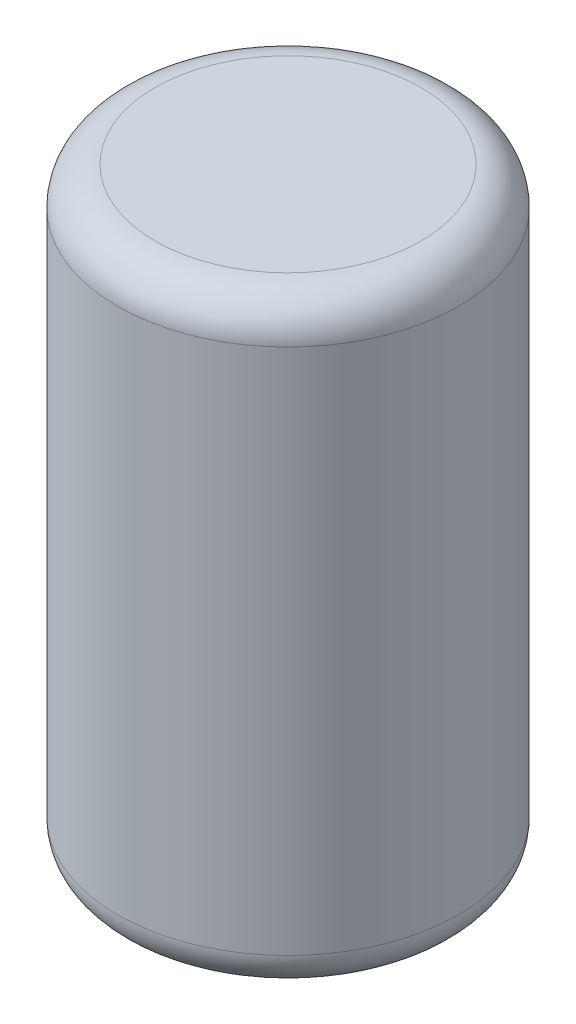
ISO-10303-21;
HEADER;
FILE_DESCRIPTION(('STEP AP214'),'2;1');
FILE_NAME('part.step','',(''),(''),'','','');
FILE_SCHEMA(('AUTOMOTIVE_DESIGN { 1 0 10303 214 1 1 1 1 }'));
ENDSEC;
DATA;
#1=APPLICATION_CONTEXT('core data for automotive mechanical design processes');
#2=APPLICATION_PROTOCOL_DEFINITION('international standard','automotive_design',2000,#1);
#3=PRODUCT_CONTEXT('',#1,'mechanical');
#4=PRODUCT('Part','Part','',(#3));
#5=PRODUCT_RELATED_PRODUCT_CATEGORY('part','',(#4));
#6=PRODUCT_DEFINITION_FORMATION('','',#4);
#7=PRODUCT_DEFINITION_CONTEXT('part definition',#1,'design');
#8=PRODUCT_DEFINITION('design','',#6,#7);
#9=PRODUCT_DEFINITION_SHAPE('','',#8);
#10=(LENGTH_UNIT() NAMED_UNIT(*) SI_UNIT(.MILLI.,.METRE.));
#11=(NAMED_UNIT(*) PLANE_ANGLE_UNIT() SI_UNIT($,.RADIAN.));
#12=(NAMED_UNIT(*) SI_UNIT($,.STERADIAN.) SOLID_ANGLE_UNIT());
#13=UNCERTAINTY_MEASURE_WITH_UNIT(LENGTH_MEASURE(1.E-05),#10,'distance_accuracy_value','');
#14=(GEOMETRIC_REPRESENTATION_CONTEXT(3) GLOBAL_UNCERTAINTY_ASSIGNED_CONTEXT((#13)) GLOBAL_UNIT_ASSIGNED_CONTEXT((#10,
#11,#12)) REPRESENTATION_CONTEXT('',''));
#15=CARTESIAN_POINT('',(0.,0.,0.));
#16=DIRECTION('',(0.,0.,1.));
#17=DIRECTION('',(1.,0.,0.));
#18=AXIS2_PLACEMENT_3D('',#15,#16,#17);
#19=CARTESIAN_POINT('',(0.,12.,0.));
#20=DIRECTION('',(0.,-1.,0.));
#21=DIRECTION('',(0.,0.,-1.));
#22=AXIS2_PLACEMENT_3D('',#19,#20,#21);
#23=CYLINDRICAL_SURFACE('',#22,3.4);
#24=CARTESIAN_POINT('',(0.,0.750000000000001,0.));
#25=DIRECTION('',(0.,1.,0.));
#26=DIRECTION('',(0.,0.,1.));
#27=AXIS2_PLACEMENT_3D('',#24,#25,#26);
#28=CIRCLE('',#27,3.4);
#29=CARTESIAN_POINT('',(0.,0.750000000000001,3.4));
#30=VERTEX_POINT('',#29);
#31=EDGE_CURVE('E57',#30,#30,#28,.T.);
#32=ORIENTED_EDGE('',*,*,#31,.T.);
#33=EDGE_LOOP('',(#32));
#34=FACE_BOUND('',#33,.T.);
#35=CARTESIAN_POINT('',(0.,11.25,0.));
#36=DIRECTION('',(0.,1.,0.));
#37=DIRECTION('',(0.,0.,1.));
#38=AXIS2_PLACEMENT_3D('',#35,#36,#37);
#39=CIRCLE('',#38,3.4);
#40=CARTESIAN_POINT('',(0.,11.25,3.4));
#41=VERTEX_POINT('',#40);
#42=EDGE_CURVE('E64',#41,#41,#39,.F.);
#43=ORIENTED_EDGE('',*,*,#42,.T.);
#44=EDGE_LOOP('',(#43));
#45=FACE_BOUND('',#44,.T.);
#46=ADVANCED_FACE('F43',(#34,#45),#23,.T.);
#47=CARTESIAN_POINT('',(0.,12.,0.));
#48=DIRECTION('',(0.,1.,0.));
#49=DIRECTION('',(0.,0.,1.));
#50=AXIS2_PLACEMENT_3D('',#47,#48,#49);
#51=PLANE('',#50);
#52=CARTESIAN_POINT('',(0.,12.,0.));
#53=DIRECTION('',(0.,1.,0.));
#54=DIRECTION('',(0.,0.,1.));
#55=AXIS2_PLACEMENT_3D('',#52,#53,#54);
#56=CIRCLE('',#55,2.65);
#57=CARTESIAN_POINT('',(0.,12.,2.65));
#58=VERTEX_POINT('',#57);
#59=EDGE_CURVE('E10',#58,#58,#56,.T.);
#60=ORIENTED_EDGE('',*,*,#59,.T.);
#61=EDGE_LOOP('',(#60));
#62=FACE_BOUND('',#61,.T.);
#63=ADVANCED_FACE('F80',(#62),#51,.T.);
#64=CARTESIAN_POINT('',(0.,0.,0.));
#65=DIRECTION('',(0.,1.,0.));
#66=DIRECTION('',(0.,0.,1.));
#67=AXIS2_PLACEMENT_3D('',#64,#65,#66);
#68=PLANE('',#67);
#69=CARTESIAN_POINT('',(0.,0.,0.));
#70=DIRECTION('',(0.,1.,0.));
#71=DIRECTION('',(0.,0.,1.));
#72=AXIS2_PLACEMENT_3D('',#69,#70,#71);
#73=CIRCLE('',#72,2.65);
#74=CARTESIAN_POINT('',(0.,0.,2.65));
#75=VERTEX_POINT('',#74);
#76=EDGE_CURVE('E51',#75,#75,#73,.F.);
#77=ORIENTED_EDGE('',*,*,#76,.T.);
#78=EDGE_LOOP('',(#77));
#79=FACE_BOUND('',#78,.T.);
#80=ADVANCED_FACE('F73',(#79),#68,.F.);
#81=CARTESIAN_POINT('',(0.,0.750000000000001,0.));
#82=DIRECTION('',(0.,1.,0.));
#83=DIRECTION('',(0.,0.,1.));
#84=AXIS2_PLACEMENT_3D('',#81,#82,#83);
#85=TOROIDAL_SURFACE('',#84,2.65,0.75);
#86=ORIENTED_EDGE('',*,*,#76,.F.);
#87=EDGE_LOOP('',(#86));
#88=FACE_BOUND('',#87,.T.);
#89=ORIENTED_EDGE('',*,*,#31,.F.);
#90=EDGE_LOOP('',(#89));
#91=FACE_BOUND('',#90,.T.);
#92=ADVANCED_FACE('F72',(#88,#91),#85,.T.);
#93=CARTESIAN_POINT('',(0.,11.25,0.));
#94=DIRECTION('',(0.,1.,0.));
#95=DIRECTION('',(0.,0.,1.));
#96=AXIS2_PLACEMENT_3D('',#93,#94,#95);
#97=TOROIDAL_SURFACE('',#96,2.65,0.75);
#98=ORIENTED_EDGE('',*,*,#42,.F.);
#99=EDGE_LOOP('',(#98));
#100=FACE_BOUND('',#99,.T.);
#101=ORIENTED_EDGE('',*,*,#59,.F.);
#102=EDGE_LOOP('',(#101));
#103=FACE_BOUND('',#102,.T.);
#104=ADVANCED_FACE('F44',(#100,#103),#97,.T.);
#105=CLOSED_SHELL('',(#46,#63,#80,#92,#104));
#106=MANIFOLD_SOLID_BREP('B2',#105);
#107=ADVANCED_BREP_SHAPE_REPRESENTATION('',(#18,#106),#14);
#108=SHAPE_DEFINITION_REPRESENTATION(#9,#107);
ENDSEC;
END-ISO-10303-21;
